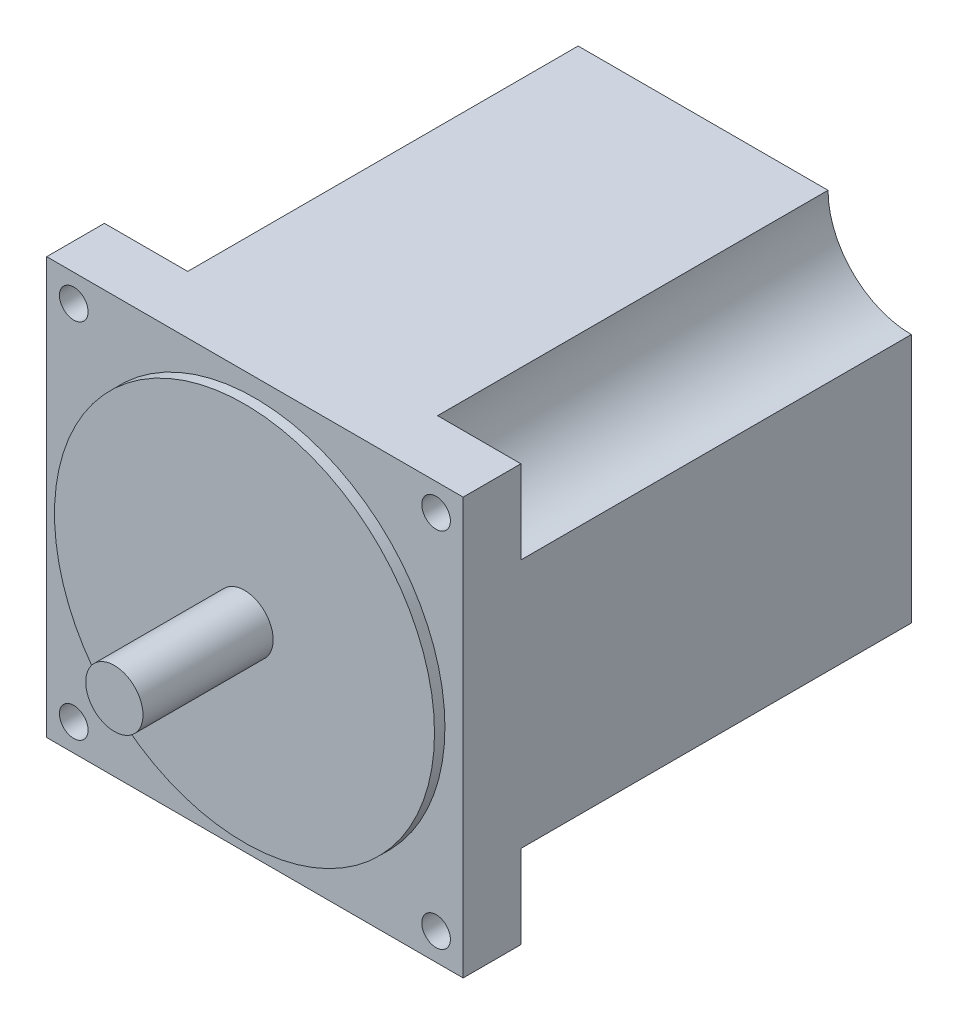
ISO-10303-21;
HEADER;
FILE_DESCRIPTION(('STEP AP214'),'2;1');
FILE_NAME('part.step','',(''),(''),'','','');
FILE_SCHEMA(('AUTOMOTIVE_DESIGN { 1 0 10303 214 1 1 1 1 }'));
ENDSEC;
DATA;
#1=APPLICATION_CONTEXT('core data for automotive mechanical design processes');
#2=APPLICATION_PROTOCOL_DEFINITION('international standard','automotive_design',2000,#1);
#3=PRODUCT_CONTEXT('',#1,'mechanical');
#4=PRODUCT('Part','Part','',(#3));
#5=PRODUCT_RELATED_PRODUCT_CATEGORY('part','',(#4));
#6=PRODUCT_DEFINITION_FORMATION('','',#4);
#7=PRODUCT_DEFINITION_CONTEXT('part definition',#1,'design');
#8=PRODUCT_DEFINITION('design','',#6,#7);
#9=PRODUCT_DEFINITION_SHAPE('','',#8);
#10=(LENGTH_UNIT() NAMED_UNIT(*) SI_UNIT(.MILLI.,.METRE.));
#11=(NAMED_UNIT(*) PLANE_ANGLE_UNIT() SI_UNIT($,.RADIAN.));
#12=(NAMED_UNIT(*) SI_UNIT($,.STERADIAN.) SOLID_ANGLE_UNIT());
#13=UNCERTAINTY_MEASURE_WITH_UNIT(LENGTH_MEASURE(1.E-05),#10,'distance_accuracy_value','');
#14=(GEOMETRIC_REPRESENTATION_CONTEXT(3) GLOBAL_UNCERTAINTY_ASSIGNED_CONTEXT((#13)) GLOBAL_UNIT_ASSIGNED_CONTEXT((#10,
#11,#12)) REPRESENTATION_CONTEXT('',''));
#15=CARTESIAN_POINT('',(0.,0.,0.));
#16=DIRECTION('',(0.,0.,1.));
#17=DIRECTION('',(1.,0.,0.));
#18=AXIS2_PLACEMENT_3D('',#15,#16,#17);
#19=CARTESIAN_POINT('',(40.,-40.,86.09));
#20=DIRECTION('',(-1.,0.,0.));
#21=DIRECTION('',(0.,0.,1.));
#22=AXIS2_PLACEMENT_3D('',#19,#20,#21);
#23=PLANE('',#22);
#24=DIRECTION('',(0.,0.,-1.));
#25=VECTOR('',#24,1.);
#26=CARTESIAN_POINT('',(40.,-24.,75.));
#27=LINE('',#26,#25);
#28=CARTESIAN_POINT('',(40.,-24.,75.));
#29=VERTEX_POINT('',#28);
#30=CARTESIAN_POINT('',(40.,-24.,0.));
#31=VERTEX_POINT('',#30);
#32=EDGE_CURVE('E200',#29,#31,#27,.T.);
#33=ORIENTED_EDGE('',*,*,#32,.T.);
#34=DIRECTION('',(0.,1.,0.));
#35=VECTOR('',#34,1.);
#36=CARTESIAN_POINT('',(40.,-40.,0.));
#37=LINE('',#36,#35);
#38=CARTESIAN_POINT('',(40.,24.,0.));
#39=VERTEX_POINT('',#38);
#40=EDGE_CURVE('E265',#31,#39,#37,.T.);
#41=ORIENTED_EDGE('',*,*,#40,.T.);
#42=DIRECTION('',(0.,0.,-1.));
#43=VECTOR('',#42,1.);
#44=CARTESIAN_POINT('',(40.,24.,75.));
#45=LINE('',#44,#43);
#46=CARTESIAN_POINT('',(40.,24.,75.));
#47=VERTEX_POINT('',#46);
#48=EDGE_CURVE('E228',#47,#39,#45,.T.);
#49=ORIENTED_EDGE('',*,*,#48,.F.);
#50=DIRECTION('',(0.,-1.,0.));
#51=VECTOR('',#50,1.);
#52=CARTESIAN_POINT('',(40.,0.,75.));
#53=LINE('',#52,#51);
#54=CARTESIAN_POINT('',(40.,40.,75.));
#55=VERTEX_POINT('',#54);
#56=EDGE_CURVE('E216',#55,#47,#53,.T.);
#57=ORIENTED_EDGE('',*,*,#56,.F.);
#58=DIRECTION('',(0.,0.,-1.));
#59=VECTOR('',#58,1.);
#60=CARTESIAN_POINT('',(40.,40.,86.09));
#61=LINE('',#60,#59);
#62=CARTESIAN_POINT('',(40.,40.,86.09));
#63=VERTEX_POINT('',#62);
#64=EDGE_CURVE('E249',#63,#55,#61,.T.);
#65=ORIENTED_EDGE('',*,*,#64,.F.);
#66=DIRECTION('',(0.,1.,0.));
#67=VECTOR('',#66,1.);
#68=CARTESIAN_POINT('',(40.,-40.,86.09));
#69=LINE('',#68,#67);
#70=CARTESIAN_POINT('',(40.,-40.,86.09));
#71=VERTEX_POINT('',#70);
#72=EDGE_CURVE('E266',#71,#63,#69,.T.);
#73=ORIENTED_EDGE('',*,*,#72,.F.);
#74=DIRECTION('',(0.,0.,-1.));
#75=VECTOR('',#74,1.);
#76=CARTESIAN_POINT('',(40.,-40.,86.09));
#77=LINE('',#76,#75);
#78=CARTESIAN_POINT('',(40.,-40.,75.));
#79=VERTEX_POINT('',#78);
#80=EDGE_CURVE('E282',#71,#79,#77,.T.);
#81=ORIENTED_EDGE('',*,*,#80,.T.);
#82=DIRECTION('',(0.,-1.,0.));
#83=VECTOR('',#82,1.);
#84=CARTESIAN_POINT('',(40.,0.,75.));
#85=LINE('',#84,#83);
#86=EDGE_CURVE('E188',#29,#79,#85,.T.);
#87=ORIENTED_EDGE('',*,*,#86,.F.);
#88=EDGE_LOOP('',(#33,#41,#49,#57,#65,#73,#81,#87));
#89=FACE_BOUND('',#88,.T.);
#90=ADVANCED_FACE('F40',(#89),#23,.F.);
#91=CARTESIAN_POINT('',(40.,40.,86.09));
#92=DIRECTION('',(0.,-1.,0.));
#93=DIRECTION('',(1.,0.,0.));
#94=AXIS2_PLACEMENT_3D('',#91,#92,#93);
#95=PLANE('',#94);
#96=DIRECTION('',(-1.,0.,0.));
#97=VECTOR('',#96,1.);
#98=CARTESIAN_POINT('',(40.,40.,0.));
#99=LINE('',#98,#97);
#100=CARTESIAN_POINT('',(24.,40.,0.));
#101=VERTEX_POINT('',#100);
#102=CARTESIAN_POINT('',(-24.,40.,0.));
#103=VERTEX_POINT('',#102);
#104=EDGE_CURVE('E150',#101,#103,#99,.T.);
#105=ORIENTED_EDGE('',*,*,#104,.T.);
#106=DIRECTION('',(0.,0.,-1.));
#107=VECTOR('',#106,1.);
#108=CARTESIAN_POINT('',(-24.,40.,75.));
#109=LINE('',#108,#107);
#110=CARTESIAN_POINT('',(-24.,40.,75.));
#111=VERTEX_POINT('',#110);
#112=EDGE_CURVE('E55',#111,#103,#109,.T.);
#113=ORIENTED_EDGE('',*,*,#112,.F.);
#114=DIRECTION('',(1.,0.,0.));
#115=VECTOR('',#114,1.);
#116=CARTESIAN_POINT('',(0.,40.,75.));
#117=LINE('',#116,#115);
#118=CARTESIAN_POINT('',(-40.,40.,75.));
#119=VERTEX_POINT('',#118);
#120=EDGE_CURVE('E136',#119,#111,#117,.T.);
#121=ORIENTED_EDGE('',*,*,#120,.F.);
#122=DIRECTION('',(0.,0.,-1.));
#123=VECTOR('',#122,1.);
#124=CARTESIAN_POINT('',(-40.,40.,86.09));
#125=LINE('',#124,#123);
#126=CARTESIAN_POINT('',(-40.,40.,86.09));
#127=VERTEX_POINT('',#126);
#128=EDGE_CURVE('E302',#127,#119,#125,.T.);
#129=ORIENTED_EDGE('',*,*,#128,.F.);
#130=DIRECTION('',(-1.,0.,0.));
#131=VECTOR('',#130,1.);
#132=CARTESIAN_POINT('',(40.,40.,86.09));
#133=LINE('',#132,#131);
#134=EDGE_CURVE('E270',#63,#127,#133,.T.);
#135=ORIENTED_EDGE('',*,*,#134,.F.);
#136=ORIENTED_EDGE('',*,*,#64,.T.);
#137=DIRECTION('',(1.,0.,0.));
#138=VECTOR('',#137,1.);
#139=CARTESIAN_POINT('',(0.,40.,75.));
#140=LINE('',#139,#138);
#141=CARTESIAN_POINT('',(24.,40.,75.));
#142=VERTEX_POINT('',#141);
#143=EDGE_CURVE('E213',#142,#55,#140,.T.);
#144=ORIENTED_EDGE('',*,*,#143,.F.);
#145=DIRECTION('',(0.,0.,-1.));
#146=VECTOR('',#145,1.);
#147=CARTESIAN_POINT('',(24.,40.,75.));
#148=LINE('',#147,#146);
#149=EDGE_CURVE('E224',#142,#101,#148,.T.);
#150=ORIENTED_EDGE('',*,*,#149,.T.);
#151=EDGE_LOOP('',(#105,#113,#121,#129,#135,#136,#144,#150));
#152=FACE_BOUND('',#151,.T.);
#153=ADVANCED_FACE('F147',(#152),#95,.F.);
#154=CARTESIAN_POINT('',(-40.,-40.,86.09));
#155=DIRECTION('',(-1.,0.,0.));
#156=DIRECTION('',(0.,0.,1.));
#157=AXIS2_PLACEMENT_3D('',#154,#155,#156);
#158=PLANE('',#157);
#159=DIRECTION('',(0.,1.,0.));
#160=VECTOR('',#159,1.);
#161=CARTESIAN_POINT('',(-40.,-40.,0.));
#162=LINE('',#161,#160);
#163=CARTESIAN_POINT('',(-40.,-24.,0.));
#164=VERTEX_POINT('',#163);
#165=CARTESIAN_POINT('',(-40.,24.,0.));
#166=VERTEX_POINT('',#165);
#167=EDGE_CURVE('E288',#164,#166,#162,.T.);
#168=ORIENTED_EDGE('',*,*,#167,.F.);
#169=DIRECTION('',(0.,0.,-1.));
#170=VECTOR('',#169,1.);
#171=CARTESIAN_POINT('',(-40.,-24.,75.));
#172=LINE('',#171,#170);
#173=CARTESIAN_POINT('',(-40.,-24.,75.));
#174=VERTEX_POINT('',#173);
#175=EDGE_CURVE('E63',#174,#164,#172,.T.);
#176=ORIENTED_EDGE('',*,*,#175,.F.);
#177=DIRECTION('',(0.,1.,0.));
#178=VECTOR('',#177,1.);
#179=CARTESIAN_POINT('',(-40.,0.,75.));
#180=LINE('',#179,#178);
#181=CARTESIAN_POINT('',(-40.,-40.,75.));
#182=VERTEX_POINT('',#181);
#183=EDGE_CURVE('E167',#182,#174,#180,.T.);
#184=ORIENTED_EDGE('',*,*,#183,.F.);
#185=DIRECTION('',(0.,0.,-1.));
#186=VECTOR('',#185,1.);
#187=CARTESIAN_POINT('',(-40.,-40.,86.09));
#188=LINE('',#187,#186);
#189=CARTESIAN_POINT('',(-40.,-40.,86.09));
#190=VERTEX_POINT('',#189);
#191=EDGE_CURVE('E298',#190,#182,#188,.T.);
#192=ORIENTED_EDGE('',*,*,#191,.F.);
#193=DIRECTION('',(0.,1.,0.));
#194=VECTOR('',#193,1.);
#195=CARTESIAN_POINT('',(-40.,-40.,86.09));
#196=LINE('',#195,#194);
#197=EDGE_CURVE('E274',#190,#127,#196,.T.);
#198=ORIENTED_EDGE('',*,*,#197,.T.);
#199=ORIENTED_EDGE('',*,*,#128,.T.);
#200=DIRECTION('',(0.,1.,0.));
#201=VECTOR('',#200,1.);
#202=CARTESIAN_POINT('',(-40.,0.,75.));
#203=LINE('',#202,#201);
#204=CARTESIAN_POINT('',(-40.,24.,75.));
#205=VERTEX_POINT('',#204);
#206=EDGE_CURVE('E135',#205,#119,#203,.T.);
#207=ORIENTED_EDGE('',*,*,#206,.F.);
#208=DIRECTION('',(0.,0.,-1.));
#209=VECTOR('',#208,1.);
#210=CARTESIAN_POINT('',(-40.,24.,75.));
#211=LINE('',#210,#209);
#212=EDGE_CURVE('E131',#205,#166,#211,.T.);
#213=ORIENTED_EDGE('',*,*,#212,.T.);
#214=EDGE_LOOP('',(#168,#176,#184,#192,#198,#199,#207,#213));
#215=FACE_BOUND('',#214,.T.);
#216=ADVANCED_FACE('F351',(#215),#158,.T.);
#217=CARTESIAN_POINT('',(40.,-40.,86.09));
#218=DIRECTION('',(0.,-1.,0.));
#219=DIRECTION('',(1.,0.,0.));
#220=AXIS2_PLACEMENT_3D('',#217,#218,#219);
#221=PLANE('',#220);
#222=DIRECTION('',(-1.,0.,0.));
#223=VECTOR('',#222,1.);
#224=CARTESIAN_POINT('',(40.,-40.,0.));
#225=LINE('',#224,#223);
#226=CARTESIAN_POINT('',(24.,-40.,0.));
#227=VERTEX_POINT('',#226);
#228=CARTESIAN_POINT('',(-24.,-40.,0.));
#229=VERTEX_POINT('',#228);
#230=EDGE_CURVE('E271',#227,#229,#225,.T.);
#231=ORIENTED_EDGE('',*,*,#230,.F.);
#232=DIRECTION('',(0.,0.,-1.));
#233=VECTOR('',#232,1.);
#234=CARTESIAN_POINT('',(24.,-40.,75.));
#235=LINE('',#234,#233);
#236=CARTESIAN_POINT('',(24.,-40.,75.));
#237=VERTEX_POINT('',#236);
#238=EDGE_CURVE('E178',#237,#227,#235,.T.);
#239=ORIENTED_EDGE('',*,*,#238,.F.);
#240=DIRECTION('',(-1.,0.,0.));
#241=VECTOR('',#240,1.);
#242=CARTESIAN_POINT('',(0.,-40.,75.));
#243=LINE('',#242,#241);
#244=EDGE_CURVE('E192',#79,#237,#243,.T.);
#245=ORIENTED_EDGE('',*,*,#244,.F.);
#246=ORIENTED_EDGE('',*,*,#80,.F.);
#247=DIRECTION('',(-1.,0.,0.));
#248=VECTOR('',#247,1.);
#249=CARTESIAN_POINT('',(40.,-40.,86.09));
#250=LINE('',#249,#248);
#251=EDGE_CURVE('E278',#71,#190,#250,.T.);
#252=ORIENTED_EDGE('',*,*,#251,.T.);
#253=ORIENTED_EDGE('',*,*,#191,.T.);
#254=DIRECTION('',(-1.,0.,0.));
#255=VECTOR('',#254,1.);
#256=CARTESIAN_POINT('',(0.,-40.,75.));
#257=LINE('',#256,#255);
#258=CARTESIAN_POINT('',(-24.,-40.,75.));
#259=VERTEX_POINT('',#258);
#260=EDGE_CURVE('E163',#259,#182,#257,.T.);
#261=ORIENTED_EDGE('',*,*,#260,.F.);
#262=DIRECTION('',(0.,0.,-1.));
#263=VECTOR('',#262,1.);
#264=CARTESIAN_POINT('',(-24.,-40.,75.));
#265=LINE('',#264,#263);
#266=EDGE_CURVE('E175',#259,#229,#265,.T.);
#267=ORIENTED_EDGE('',*,*,#266,.T.);
#268=EDGE_LOOP('',(#231,#239,#245,#246,#252,#253,#261,#267));
#269=FACE_BOUND('',#268,.T.);
#270=ADVANCED_FACE('F342',(#269),#221,.T.);
#271=CARTESIAN_POINT('',(0.,0.,0.));
#272=DIRECTION('',(0.,0.,1.));
#273=DIRECTION('',(1.,0.,0.));
#274=AXIS2_PLACEMENT_3D('',#271,#272,#273);
#275=PLANE('',#274);
#276=CARTESIAN_POINT('',(0.,0.,0.));
#277=DIRECTION('',(0.,0.,1.));
#278=DIRECTION('',(1.,0.,0.));
#279=AXIS2_PLACEMENT_3D('',#276,#277,#278);
#280=CIRCLE('',#279,4.006);
#281=CARTESIAN_POINT('',(4.006,0.,0.));
#282=VERTEX_POINT('',#281);
#283=EDGE_CURVE('E11',#282,#282,#280,.F.);
#284=ORIENTED_EDGE('',*,*,#283,.F.);
#285=EDGE_LOOP('',(#284));
#286=FACE_BOUND('',#285,.T.);
#287=CARTESIAN_POINT('',(40.,-40.,0.));
#288=DIRECTION('',(0.,0.,-1.));
#289=DIRECTION('',(-1.,0.,0.));
#290=AXIS2_PLACEMENT_3D('',#287,#288,#289);
#291=CIRCLE('',#290,16.);
#292=EDGE_CURVE('E189',#31,#227,#291,.F.);
#293=ORIENTED_EDGE('',*,*,#292,.T.);
#294=ORIENTED_EDGE('',*,*,#230,.T.);
#295=CARTESIAN_POINT('',(-40.,-40.,0.));
#296=DIRECTION('',(0.,0.,-1.));
#297=DIRECTION('',(-1.,0.,0.));
#298=AXIS2_PLACEMENT_3D('',#295,#296,#297);
#299=CIRCLE('',#298,16.);
#300=EDGE_CURVE('E164',#229,#164,#299,.F.);
#301=ORIENTED_EDGE('',*,*,#300,.T.);
#302=ORIENTED_EDGE('',*,*,#167,.T.);
#303=CARTESIAN_POINT('',(-40.,40.,0.));
#304=DIRECTION('',(0.,0.,-1.));
#305=DIRECTION('',(-1.,0.,0.));
#306=AXIS2_PLACEMENT_3D('',#303,#304,#305);
#307=CIRCLE('',#306,16.);
#308=EDGE_CURVE('E181',#103,#166,#307,.T.);
#309=ORIENTED_EDGE('',*,*,#308,.F.);
#310=ORIENTED_EDGE('',*,*,#104,.F.);
#311=CARTESIAN_POINT('',(40.,40.,0.));
#312=DIRECTION('',(0.,0.,-1.));
#313=DIRECTION('',(-1.,0.,0.));
#314=AXIS2_PLACEMENT_3D('',#311,#312,#313);
#315=CIRCLE('',#314,16.);
#316=EDGE_CURVE('E155',#101,#39,#315,.F.);
#317=ORIENTED_EDGE('',*,*,#316,.T.);
#318=ORIENTED_EDGE('',*,*,#40,.F.);
#319=EDGE_LOOP('',(#293,#294,#301,#302,#309,#310,#317,#318));
#320=FACE_BOUND('',#319,.T.);
#321=ADVANCED_FACE('F320',(#286,#320),#275,.F.);
#322=CARTESIAN_POINT('',(-34.8,34.8,0.));
#323=DIRECTION('',(0.,0.,1.));
#324=DIRECTION('',(1.,0.,0.));
#325=AXIS2_PLACEMENT_3D('',#322,#323,#324);
#326=CYLINDRICAL_SURFACE('',#325,2.75);
#327=CARTESIAN_POINT('',(-34.8,34.8,86.09));
#328=DIRECTION('',(0.,0.,1.));
#329=DIRECTION('',(1.,0.,0.));
#330=AXIS2_PLACEMENT_3D('',#327,#328,#329);
#331=CIRCLE('',#330,2.75);
#332=CARTESIAN_POINT('',(-32.05,34.8,86.09));
#333=VERTEX_POINT('',#332);
#334=EDGE_CURVE('E258',#333,#333,#331,.T.);
#335=ORIENTED_EDGE('',*,*,#334,.T.);
#336=EDGE_LOOP('',(#335));
#337=FACE_BOUND('',#336,.T.);
#338=CARTESIAN_POINT('',(-34.8,34.8,75.));
#339=DIRECTION('',(0.,0.,-1.));
#340=DIRECTION('',(-1.,0.,0.));
#341=AXIS2_PLACEMENT_3D('',#338,#339,#340);
#342=CIRCLE('',#341,2.75);
#343=CARTESIAN_POINT('',(-37.55,34.8,75.));
#344=VERTEX_POINT('',#343);
#345=EDGE_CURVE('E144',#344,#344,#342,.F.);
#346=ORIENTED_EDGE('',*,*,#345,.F.);
#347=EDGE_LOOP('',(#346));
#348=FACE_BOUND('',#347,.T.);
#349=ADVANCED_FACE('F341',(#337,#348),#326,.F.);
#350=CARTESIAN_POINT('',(34.8,-34.8,0.));
#351=DIRECTION('',(0.,0.,1.));
#352=DIRECTION('',(1.,0.,0.));
#353=AXIS2_PLACEMENT_3D('',#350,#351,#352);
#354=CYLINDRICAL_SURFACE('',#353,2.75);
#355=CARTESIAN_POINT('',(34.8,-34.8,86.09));
#356=DIRECTION('',(0.,0.,1.));
#357=DIRECTION('',(1.,0.,0.));
#358=AXIS2_PLACEMENT_3D('',#355,#356,#357);
#359=CIRCLE('',#358,2.75);
#360=CARTESIAN_POINT('',(37.55,-34.8,86.09));
#361=VERTEX_POINT('',#360);
#362=EDGE_CURVE('E245',#361,#361,#359,.T.);
#363=ORIENTED_EDGE('',*,*,#362,.T.);
#364=EDGE_LOOP('',(#363));
#365=FACE_BOUND('',#364,.T.);
#366=CARTESIAN_POINT('',(34.8,-34.8,75.));
#367=DIRECTION('',(0.,0.,-1.));
#368=DIRECTION('',(-1.,0.,0.));
#369=AXIS2_PLACEMENT_3D('',#366,#367,#368);
#370=CIRCLE('',#369,2.75);
#371=CARTESIAN_POINT('',(32.05,-34.8,75.));
#372=VERTEX_POINT('',#371);
#373=EDGE_CURVE('E196',#372,#372,#370,.F.);
#374=ORIENTED_EDGE('',*,*,#373,.F.);
#375=EDGE_LOOP('',(#374));
#376=FACE_BOUND('',#375,.T.);
#377=ADVANCED_FACE('F348',(#365,#376),#354,.F.);
#378=CARTESIAN_POINT('',(-34.8,-34.8,0.));
#379=DIRECTION('',(0.,0.,1.));
#380=DIRECTION('',(1.,0.,0.));
#381=AXIS2_PLACEMENT_3D('',#378,#379,#380);
#382=CYLINDRICAL_SURFACE('',#381,2.75);
#383=CARTESIAN_POINT('',(-34.8,-34.8,86.09));
#384=DIRECTION('',(0.,0.,1.));
#385=DIRECTION('',(1.,0.,0.));
#386=AXIS2_PLACEMENT_3D('',#383,#384,#385);
#387=CIRCLE('',#386,2.75);
#388=CARTESIAN_POINT('',(-32.05,-34.8,86.09));
#389=VERTEX_POINT('',#388);
#390=EDGE_CURVE('E253',#389,#389,#387,.T.);
#391=ORIENTED_EDGE('',*,*,#390,.T.);
#392=EDGE_LOOP('',(#391));
#393=FACE_BOUND('',#392,.T.);
#394=CARTESIAN_POINT('',(-34.8,-34.8,75.));
#395=DIRECTION('',(0.,0.,-1.));
#396=DIRECTION('',(-1.,0.,0.));
#397=AXIS2_PLACEMENT_3D('',#394,#395,#396);
#398=CIRCLE('',#397,2.75);
#399=CARTESIAN_POINT('',(-37.55,-34.8,75.));
#400=VERTEX_POINT('',#399);
#401=EDGE_CURVE('E171',#400,#400,#398,.F.);
#402=ORIENTED_EDGE('',*,*,#401,.F.);
#403=EDGE_LOOP('',(#402));
#404=FACE_BOUND('',#403,.T.);
#405=ADVANCED_FACE('F390',(#393,#404),#382,.F.);
#406=CARTESIAN_POINT('',(34.8,34.8,0.));
#407=DIRECTION('',(0.,0.,1.));
#408=DIRECTION('',(1.,0.,0.));
#409=AXIS2_PLACEMENT_3D('',#406,#407,#408);
#410=CYLINDRICAL_SURFACE('',#409,2.75);
#411=CARTESIAN_POINT('',(34.8,34.8,86.09));
#412=DIRECTION('',(0.,0.,1.));
#413=DIRECTION('',(1.,0.,0.));
#414=AXIS2_PLACEMENT_3D('',#411,#412,#413);
#415=CIRCLE('',#414,2.75);
#416=CARTESIAN_POINT('',(37.55,34.8,86.09));
#417=VERTEX_POINT('',#416);
#418=EDGE_CURVE('E254',#417,#417,#415,.T.);
#419=ORIENTED_EDGE('',*,*,#418,.T.);
#420=EDGE_LOOP('',(#419));
#421=FACE_BOUND('',#420,.T.);
#422=CARTESIAN_POINT('',(34.8,34.8,75.));
#423=DIRECTION('',(0.,0.,-1.));
#424=DIRECTION('',(-1.,0.,0.));
#425=AXIS2_PLACEMENT_3D('',#422,#423,#424);
#426=CIRCLE('',#425,2.75);
#427=CARTESIAN_POINT('',(32.05,34.8,75.));
#428=VERTEX_POINT('',#427);
#429=EDGE_CURVE('E220',#428,#428,#426,.F.);
#430=ORIENTED_EDGE('',*,*,#429,.F.);
#431=EDGE_LOOP('',(#430));
#432=FACE_BOUND('',#431,.T.);
#433=ADVANCED_FACE('F392',(#421,#432),#410,.F.);
#434=CARTESIAN_POINT('',(0.,0.,86.09));
#435=DIRECTION('',(0.,0.,1.));
#436=DIRECTION('',(1.,0.,0.));
#437=AXIS2_PLACEMENT_3D('',#434,#435,#436);
#438=PLANE('',#437);
#439=CARTESIAN_POINT('',(0.,0.,86.09));
#440=DIRECTION('',(0.,0.,1.));
#441=DIRECTION('',(1.,0.,0.));
#442=AXIS2_PLACEMENT_3D('',#439,#440,#441);
#443=CIRCLE('',#442,36.5);
#444=CARTESIAN_POINT('',(36.5,0.,86.09));
#445=VERTEX_POINT('',#444);
#446=EDGE_CURVE('E241',#445,#445,#443,.T.);
#447=ORIENTED_EDGE('',*,*,#446,.F.);
#448=EDGE_LOOP('',(#447));
#449=FACE_BOUND('',#448,.T.);
#450=ORIENTED_EDGE('',*,*,#418,.F.);
#451=EDGE_LOOP('',(#450));
#452=FACE_BOUND('',#451,.T.);
#453=ORIENTED_EDGE('',*,*,#390,.F.);
#454=EDGE_LOOP('',(#453));
#455=FACE_BOUND('',#454,.T.);
#456=ORIENTED_EDGE('',*,*,#362,.F.);
#457=EDGE_LOOP('',(#456));
#458=FACE_BOUND('',#457,.T.);
#459=ORIENTED_EDGE('',*,*,#334,.F.);
#460=EDGE_LOOP('',(#459));
#461=FACE_BOUND('',#460,.T.);
#462=ORIENTED_EDGE('',*,*,#72,.T.);
#463=ORIENTED_EDGE('',*,*,#134,.T.);
#464=ORIENTED_EDGE('',*,*,#197,.F.);
#465=ORIENTED_EDGE('',*,*,#251,.F.);
#466=EDGE_LOOP('',(#462,#463,#464,#465));
#467=FACE_BOUND('',#466,.T.);
#468=ADVANCED_FACE('F369',(#449,#452,#455,#458,#461,#467),#438,.T.);
#469=CARTESIAN_POINT('',(0.,0.,88.09));
#470=DIRECTION('',(0.,0.,-1.));
#471=DIRECTION('',(-1.,0.,0.));
#472=AXIS2_PLACEMENT_3D('',#469,#470,#471);
#473=CYLINDRICAL_SURFACE('',#472,36.5);
#474=CARTESIAN_POINT('',(0.,0.,88.09));
#475=DIRECTION('',(0.,0.,1.));
#476=DIRECTION('',(1.,0.,0.));
#477=AXIS2_PLACEMENT_3D('',#474,#475,#476);
#478=CIRCLE('',#477,36.5);
#479=CARTESIAN_POINT('',(36.5,0.,88.09));
#480=VERTEX_POINT('',#479);
#481=EDGE_CURVE('E237',#480,#480,#478,.T.);
#482=ORIENTED_EDGE('',*,*,#481,.F.);
#483=EDGE_LOOP('',(#482));
#484=FACE_BOUND('',#483,.T.);
#485=ORIENTED_EDGE('',*,*,#446,.T.);
#486=EDGE_LOOP('',(#485));
#487=FACE_BOUND('',#486,.T.);
#488=ADVANCED_FACE('F404',(#484,#487),#473,.T.);
#489=CARTESIAN_POINT('',(0.,0.,88.09));
#490=DIRECTION('',(0.,0.,1.));
#491=DIRECTION('',(1.,0.,0.));
#492=AXIS2_PLACEMENT_3D('',#489,#490,#491);
#493=PLANE('',#492);
#494=CARTESIAN_POINT('',(0.,0.,88.09));
#495=DIRECTION('',(0.,0.,1.));
#496=DIRECTION('',(1.,0.,0.));
#497=AXIS2_PLACEMENT_3D('',#494,#495,#496);
#498=CIRCLE('',#497,5.5);
#499=CARTESIAN_POINT('',(5.5,0.,88.09));
#500=VERTEX_POINT('',#499);
#501=EDGE_CURVE('E48',#500,#500,#498,.T.);
#502=ORIENTED_EDGE('',*,*,#501,.F.);
#503=EDGE_LOOP('',(#502));
#504=FACE_BOUND('',#503,.T.);
#505=ORIENTED_EDGE('',*,*,#481,.T.);
#506=EDGE_LOOP('',(#505));
#507=FACE_BOUND('',#506,.T.);
#508=ADVANCED_FACE('F409',(#504,#507),#493,.T.);
#509=CARTESIAN_POINT('',(0.,0.,113.09));
#510=DIRECTION('',(0.,0.,-1.));
#511=DIRECTION('',(-1.,0.,0.));
#512=AXIS2_PLACEMENT_3D('',#509,#510,#511);
#513=CYLINDRICAL_SURFACE('',#512,5.5);
#514=CARTESIAN_POINT('',(0.,0.,113.09));
#515=DIRECTION('',(0.,0.,1.));
#516=DIRECTION('',(1.,0.,0.));
#517=AXIS2_PLACEMENT_3D('',#514,#515,#516);
#518=CIRCLE('',#517,5.5);
#519=CARTESIAN_POINT('',(5.5,0.,113.09));
#520=VERTEX_POINT('',#519);
#521=EDGE_CURVE('E231',#520,#520,#518,.T.);
#522=ORIENTED_EDGE('',*,*,#521,.F.);
#523=EDGE_LOOP('',(#522));
#524=FACE_BOUND('',#523,.T.);
#525=ORIENTED_EDGE('',*,*,#501,.T.);
#526=EDGE_LOOP('',(#525));
#527=FACE_BOUND('',#526,.T.);
#528=ADVANCED_FACE('F445',(#524,#527),#513,.T.);
#529=CARTESIAN_POINT('',(0.,0.,113.09));
#530=DIRECTION('',(0.,0.,1.));
#531=DIRECTION('',(1.,0.,0.));
#532=AXIS2_PLACEMENT_3D('',#529,#530,#531);
#533=PLANE('',#532);
#534=ORIENTED_EDGE('',*,*,#521,.T.);
#535=EDGE_LOOP('',(#534));
#536=FACE_BOUND('',#535,.T.);
#537=ADVANCED_FACE('F442',(#536),#533,.T.);
#538=CARTESIAN_POINT('',(40.,40.,75.));
#539=DIRECTION('',(0.,0.,-1.));
#540=DIRECTION('',(-1.,0.,0.));
#541=AXIS2_PLACEMENT_3D('',#538,#539,#540);
#542=CYLINDRICAL_SURFACE('',#541,16.);
#543=ORIENTED_EDGE('',*,*,#316,.F.);
#544=ORIENTED_EDGE('',*,*,#149,.F.);
#545=CARTESIAN_POINT('',(40.,40.,75.));
#546=DIRECTION('',(0.,0.,-1.));
#547=DIRECTION('',(-1.,0.,0.));
#548=AXIS2_PLACEMENT_3D('',#545,#546,#547);
#549=CIRCLE('',#548,16.);
#550=EDGE_CURVE('E210',#142,#47,#549,.F.);
#551=ORIENTED_EDGE('',*,*,#550,.T.);
#552=ORIENTED_EDGE('',*,*,#48,.T.);
#553=EDGE_LOOP('',(#543,#544,#551,#552));
#554=FACE_BOUND('',#553,.T.);
#555=ADVANCED_FACE('F318',(#554),#542,.F.);
#556=CARTESIAN_POINT('',(0.,0.,75.));
#557=DIRECTION('',(0.,0.,-1.));
#558=DIRECTION('',(-1.,0.,0.));
#559=AXIS2_PLACEMENT_3D('',#556,#557,#558);
#560=PLANE('',#559);
#561=ORIENTED_EDGE('',*,*,#550,.F.);
#562=ORIENTED_EDGE('',*,*,#143,.T.);
#563=ORIENTED_EDGE('',*,*,#56,.T.);
#564=EDGE_LOOP('',(#561,#562,#563));
#565=FACE_BOUND('',#564,.T.);
#566=ORIENTED_EDGE('',*,*,#429,.T.);
#567=EDGE_LOOP('',(#566));
#568=FACE_BOUND('',#567,.T.);
#569=ADVANCED_FACE('F315',(#565,#568),#560,.T.);
#570=CARTESIAN_POINT('',(-40.,-40.,75.));
#571=DIRECTION('',(0.,0.,-1.));
#572=DIRECTION('',(-1.,0.,0.));
#573=AXIS2_PLACEMENT_3D('',#570,#571,#572);
#574=CYLINDRICAL_SURFACE('',#573,16.);
#575=ORIENTED_EDGE('',*,*,#300,.F.);
#576=ORIENTED_EDGE('',*,*,#266,.F.);
#577=CARTESIAN_POINT('',(-40.,-40.,75.));
#578=DIRECTION('',(0.,0.,-1.));
#579=DIRECTION('',(-1.,0.,0.));
#580=AXIS2_PLACEMENT_3D('',#577,#578,#579);
#581=CIRCLE('',#580,16.);
#582=EDGE_CURVE('E160',#259,#174,#581,.F.);
#583=ORIENTED_EDGE('',*,*,#582,.T.);
#584=ORIENTED_EDGE('',*,*,#175,.T.);
#585=EDGE_LOOP('',(#575,#576,#583,#584));
#586=FACE_BOUND('',#585,.T.);
#587=ADVANCED_FACE('F382',(#586),#574,.F.);
#588=CARTESIAN_POINT('',(0.,0.,75.));
#589=DIRECTION('',(0.,0.,-1.));
#590=DIRECTION('',(-1.,0.,0.));
#591=AXIS2_PLACEMENT_3D('',#588,#589,#590);
#592=PLANE('',#591);
#593=ORIENTED_EDGE('',*,*,#582,.F.);
#594=ORIENTED_EDGE('',*,*,#260,.T.);
#595=ORIENTED_EDGE('',*,*,#183,.T.);
#596=EDGE_LOOP('',(#593,#594,#595));
#597=FACE_BOUND('',#596,.T.);
#598=ORIENTED_EDGE('',*,*,#401,.T.);
#599=EDGE_LOOP('',(#598));
#600=FACE_BOUND('',#599,.T.);
#601=ADVANCED_FACE('F384',(#597,#600),#592,.T.);
#602=CARTESIAN_POINT('',(40.,-40.,75.));
#603=DIRECTION('',(0.,0.,-1.));
#604=DIRECTION('',(-1.,0.,0.));
#605=AXIS2_PLACEMENT_3D('',#602,#603,#604);
#606=CYLINDRICAL_SURFACE('',#605,16.);
#607=ORIENTED_EDGE('',*,*,#292,.F.);
#608=ORIENTED_EDGE('',*,*,#32,.F.);
#609=CARTESIAN_POINT('',(40.,-40.,75.));
#610=DIRECTION('',(0.,0.,-1.));
#611=DIRECTION('',(-1.,0.,0.));
#612=AXIS2_PLACEMENT_3D('',#609,#610,#611);
#613=CIRCLE('',#612,16.);
#614=EDGE_CURVE('E185',#29,#237,#613,.F.);
#615=ORIENTED_EDGE('',*,*,#614,.T.);
#616=ORIENTED_EDGE('',*,*,#238,.T.);
#617=EDGE_LOOP('',(#607,#608,#615,#616));
#618=FACE_BOUND('',#617,.T.);
#619=ADVANCED_FACE('F380',(#618),#606,.F.);
#620=CARTESIAN_POINT('',(0.,0.,75.));
#621=DIRECTION('',(0.,0.,-1.));
#622=DIRECTION('',(-1.,0.,0.));
#623=AXIS2_PLACEMENT_3D('',#620,#621,#622);
#624=PLANE('',#623);
#625=ORIENTED_EDGE('',*,*,#614,.F.);
#626=ORIENTED_EDGE('',*,*,#86,.T.);
#627=ORIENTED_EDGE('',*,*,#244,.T.);
#628=EDGE_LOOP('',(#625,#626,#627));
#629=FACE_BOUND('',#628,.T.);
#630=ORIENTED_EDGE('',*,*,#373,.T.);
#631=EDGE_LOOP('',(#630));
#632=FACE_BOUND('',#631,.T.);
#633=ADVANCED_FACE('F377',(#629,#632),#624,.T.);
#634=CARTESIAN_POINT('',(-40.,40.,75.));
#635=DIRECTION('',(0.,0.,-1.));
#636=DIRECTION('',(-1.,0.,0.));
#637=AXIS2_PLACEMENT_3D('',#634,#635,#636);
#638=CYLINDRICAL_SURFACE('',#637,16.);
#639=ORIENTED_EDGE('',*,*,#308,.T.);
#640=ORIENTED_EDGE('',*,*,#212,.F.);
#641=CARTESIAN_POINT('',(-40.,40.,75.));
#642=DIRECTION('',(0.,0.,-1.));
#643=DIRECTION('',(-1.,0.,0.));
#644=AXIS2_PLACEMENT_3D('',#641,#642,#643);
#645=CIRCLE('',#644,16.);
#646=EDGE_CURVE('E127',#111,#205,#645,.T.);
#647=ORIENTED_EDGE('',*,*,#646,.F.);
#648=ORIENTED_EDGE('',*,*,#112,.T.);
#649=EDGE_LOOP('',(#639,#640,#647,#648));
#650=FACE_BOUND('',#649,.T.);
#651=ADVANCED_FACE('F129',(#650),#638,.F.);
#652=CARTESIAN_POINT('',(0.,0.,75.));
#653=DIRECTION('',(0.,0.,-1.));
#654=DIRECTION('',(-1.,0.,0.));
#655=AXIS2_PLACEMENT_3D('',#652,#653,#654);
#656=PLANE('',#655);
#657=ORIENTED_EDGE('',*,*,#345,.T.);
#658=EDGE_LOOP('',(#657));
#659=FACE_BOUND('',#658,.T.);
#660=ORIENTED_EDGE('',*,*,#120,.T.);
#661=ORIENTED_EDGE('',*,*,#646,.T.);
#662=ORIENTED_EDGE('',*,*,#206,.T.);
#663=EDGE_LOOP('',(#660,#661,#662));
#664=FACE_BOUND('',#663,.T.);
#665=ADVANCED_FACE('F139',(#659,#664),#656,.T.);
#666=CARTESIAN_POINT('',(0.,0.,-13.5));
#667=DIRECTION('',(0.,0.,1.));
#668=DIRECTION('',(1.,0.,0.));
#669=AXIS2_PLACEMENT_3D('',#666,#667,#668);
#670=CYLINDRICAL_SURFACE('',#669,4.006);
#671=CARTESIAN_POINT('',(0.,0.,-13.5));
#672=DIRECTION('',(0.,0.,-1.));
#673=DIRECTION('',(-1.,0.,0.));
#674=AXIS2_PLACEMENT_3D('',#671,#672,#673);
#675=CIRCLE('',#674,4.006);
#676=CARTESIAN_POINT('',(-4.006,0.,-13.5));
#677=VERTEX_POINT('',#676);
#678=EDGE_CURVE('E204',#677,#677,#675,.T.);
#679=ORIENTED_EDGE('',*,*,#678,.F.);
#680=EDGE_LOOP('',(#679));
#681=FACE_BOUND('',#680,.T.);
#682=ORIENTED_EDGE('',*,*,#283,.T.);
#683=EDGE_LOOP('',(#682));
#684=FACE_BOUND('',#683,.T.);
#685=ADVANCED_FACE('F334',(#681,#684),#670,.T.);
#686=CARTESIAN_POINT('',(0.,0.,-13.5));
#687=DIRECTION('',(0.,0.,-1.));
#688=DIRECTION('',(-1.,0.,0.));
#689=AXIS2_PLACEMENT_3D('',#686,#687,#688);
#690=PLANE('',#689);
#691=ORIENTED_EDGE('',*,*,#678,.T.);
#692=EDGE_LOOP('',(#691));
#693=FACE_BOUND('',#692,.T.);
#694=ADVANCED_FACE('F332',(#693),#690,.T.);
#695=CLOSED_SHELL('',(#90,#153,#216,#270,#321,#349,#377,#405,#433,#468,#488,#508,#528,#537,#555,
#569,#587,#601,#619,#633,#651,#665,#685,#694));
#696=MANIFOLD_SOLID_BREP('B2',#695);
#697=ADVANCED_BREP_SHAPE_REPRESENTATION('',(#18,#696),#14);
#698=SHAPE_DEFINITION_REPRESENTATION(#9,#697);
ENDSEC;
END-ISO-10303-21;
